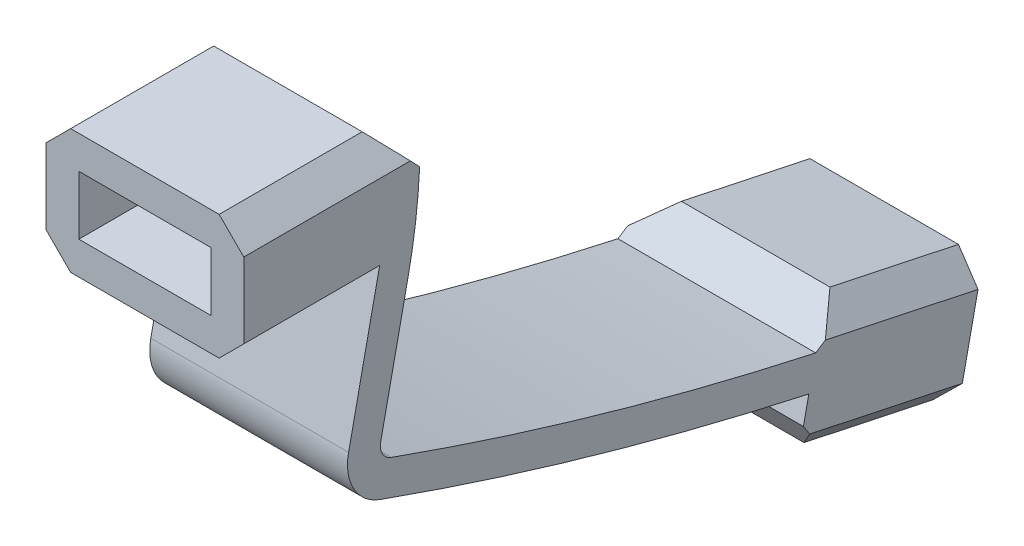
ISO-10303-21;
HEADER;
FILE_DESCRIPTION(('STEP AP214'),'2;1');
FILE_NAME('part.step','',(''),(''),'','','');
FILE_SCHEMA(('AUTOMOTIVE_DESIGN { 1 0 10303 214 1 1 1 1 }'));
ENDSEC;
DATA;
#1=APPLICATION_CONTEXT('core data for automotive mechanical design processes');
#2=APPLICATION_PROTOCOL_DEFINITION('international standard','automotive_design',2000,#1);
#3=PRODUCT_CONTEXT('',#1,'mechanical');
#4=PRODUCT('Part','Part','',(#3));
#5=PRODUCT_RELATED_PRODUCT_CATEGORY('part','',(#4));
#6=PRODUCT_DEFINITION_FORMATION('','',#4);
#7=PRODUCT_DEFINITION_CONTEXT('part definition',#1,'design');
#8=PRODUCT_DEFINITION('design','',#6,#7);
#9=PRODUCT_DEFINITION_SHAPE('','',#8);
#10=(LENGTH_UNIT() NAMED_UNIT(*) SI_UNIT(.MILLI.,.METRE.));
#11=(NAMED_UNIT(*) PLANE_ANGLE_UNIT() SI_UNIT($,.RADIAN.));
#12=(NAMED_UNIT(*) SI_UNIT($,.STERADIAN.) SOLID_ANGLE_UNIT());
#13=UNCERTAINTY_MEASURE_WITH_UNIT(LENGTH_MEASURE(1.E-05),#10,'distance_accuracy_value','');
#14=(GEOMETRIC_REPRESENTATION_CONTEXT(3) GLOBAL_UNCERTAINTY_ASSIGNED_CONTEXT((#13)) GLOBAL_UNIT_ASSIGNED_CONTEXT((#10,
#11,#12)) REPRESENTATION_CONTEXT('',''));
#15=CARTESIAN_POINT('',(0.,0.,0.));
#16=DIRECTION('',(0.,0.,1.));
#17=DIRECTION('',(1.,0.,0.));
#18=AXIS2_PLACEMENT_3D('',#15,#16,#17);
#19=CARTESIAN_POINT('',(0.,-8.40410320127912,-39.5381969639027));
#20=DIRECTION('',(0.,-0.207911690817756,-0.978147600733806));
#21=DIRECTION('',(0.,0.978147600733806,-0.207911690817756));
#22=AXIS2_PLACEMENT_3D('',#19,#20,#21);
#23=PLANE('',#22);
#24=DIRECTION('',(-1.,0.,0.));
#25=VECTOR('',#24,1.);
#26=CARTESIAN_POINT('',(-6.02,-27.7126440535357,-35.434039909482));
#27=LINE('',#26,#25);
#28=CARTESIAN_POINT('',(4.52000000000001,-27.7126440535357,-35.434039909482));
#29=VERTEX_POINT('',#28);
#30=CARTESIAN_POINT('',(-4.52,-27.7126440535357,-35.434039909482));
#31=VERTEX_POINT('',#30);
#32=EDGE_CURVE('E392',#29,#31,#27,.T.);
#33=ORIENTED_EDGE('',*,*,#32,.T.);
#34=DIRECTION('',(0.707106781186548,-0.691654801480226,0.147015766465196));
#35=VECTOR('',#34,1.);
#36=CARTESIAN_POINT('',(-12.1299525704358,-20.2689872050658,-37.0162380154442));
#37=LINE('',#36,#35);
#38=CARTESIAN_POINT('',(-6.02,-26.245422652435,-35.7459074457086));
#39=VERTEX_POINT('',#38);
#40=EDGE_CURVE('E425',#31,#39,#37,.F.);
#41=ORIENTED_EDGE('',*,*,#40,.T.);
#42=DIRECTION('',(0.,0.978147600733806,-0.207911690817756));
#43=VECTOR('',#42,1.);
#44=CARTESIAN_POINT('',(-6.02,-27.7126440535357,-35.434039909482));
#45=LINE('',#44,#43);
#46=CARTESIAN_POINT('',(-6.02,-21.7655066410741,-36.698142989654));
#47=VERTEX_POINT('',#46);
#48=EDGE_CURVE('E395',#39,#47,#45,.T.);
#49=ORIENTED_EDGE('',*,*,#48,.T.);
#50=DIRECTION('',(-0.707106781186546,-0.691654801480228,0.147015766465196));
#51=VECTOR('',#50,1.);
#52=CARTESIAN_POINT('',(3.81995257043578,-12.1405806429678,-38.7439841661398));
#53=LINE('',#52,#51);
#54=CARTESIAN_POINT('',(-4.52000000000001,-20.2982852399733,-37.0100105258806));
#55=VERTEX_POINT('',#54);
#56=EDGE_CURVE('E419',#47,#55,#53,.F.);
#57=ORIENTED_EDGE('',*,*,#56,.T.);
#58=DIRECTION('',(1.,0.,0.));
#59=VECTOR('',#58,1.);
#60=CARTESIAN_POINT('',(-6.02,-20.2982852399733,-37.0100105258806));
#61=LINE('',#60,#59);
#62=CARTESIAN_POINT('',(4.52,-20.2982852399733,-37.0100105258806));
#63=VERTEX_POINT('',#62);
#64=EDGE_CURVE('E398',#55,#63,#61,.T.);
#65=ORIENTED_EDGE('',*,*,#64,.T.);
#66=DIRECTION('',(-0.707106781186548,0.691654801480226,-0.147015766465196));
#67=VECTOR('',#66,1.);
#68=CARTESIAN_POINT('',(-3.8199525704358,-12.1405806429678,-38.7439841661398));
#69=LINE('',#68,#67);
#70=CARTESIAN_POINT('',(6.02,-21.7655066410741,-36.698142989654));
#71=VERTEX_POINT('',#70);
#72=EDGE_CURVE('E421',#63,#71,#69,.F.);
#73=ORIENTED_EDGE('',*,*,#72,.T.);
#74=DIRECTION('',(0.,-0.978147600733806,0.207911690817756));
#75=VECTOR('',#74,1.);
#76=CARTESIAN_POINT('',(6.02,-27.7126440535357,-35.434039909482));
#77=LINE('',#76,#75);
#78=CARTESIAN_POINT('',(6.02,-26.245422652435,-35.7459074457086));
#79=VERTEX_POINT('',#78);
#80=EDGE_CURVE('E389',#71,#79,#77,.T.);
#81=ORIENTED_EDGE('',*,*,#80,.T.);
#82=DIRECTION('',(0.707106781186546,0.691654801480228,-0.147015766465197));
#83=VECTOR('',#82,1.);
#84=CARTESIAN_POINT('',(12.1299525704359,-20.2689872050658,-37.0162380154442));
#85=LINE('',#84,#83);
#86=EDGE_CURVE('E423',#79,#29,#85,.F.);
#87=ORIENTED_EDGE('',*,*,#86,.T.);
#88=EDGE_LOOP('',(#33,#41,#49,#57,#65,#73,#81,#87));
#89=FACE_BOUND('',#88,.T.);
#90=DIRECTION('',(1.,0.,0.));
#91=VECTOR('',#90,1.);
#92=CARTESIAN_POINT('',(4.02,-22.2545804414409,-36.5941871442451));
#93=LINE('',#92,#91);
#94=CARTESIAN_POINT('',(-4.02,-22.2545804414409,-36.5941871442451));
#95=VERTEX_POINT('',#94);
#96=CARTESIAN_POINT('',(4.02,-22.2545804414409,-36.5941871442451));
#97=VERTEX_POINT('',#96);
#98=EDGE_CURVE('E363',#95,#97,#93,.T.);
#99=ORIENTED_EDGE('',*,*,#98,.F.);
#100=DIRECTION('',(0.,0.978147600733807,-0.207911690817754));
#101=VECTOR('',#100,1.);
#102=CARTESIAN_POINT('',(-4.02,-22.2545804414409,-36.5941871442451));
#103=LINE('',#102,#101);
#104=CARTESIAN_POINT('',(-4.02,-25.756348852068,-35.8498632911175));
#105=VERTEX_POINT('',#104);
#106=EDGE_CURVE('E361',#105,#95,#103,.T.);
#107=ORIENTED_EDGE('',*,*,#106,.F.);
#108=DIRECTION('',(-1.,0.,0.));
#109=VECTOR('',#108,1.);
#110=CARTESIAN_POINT('',(4.02,-25.756348852068,-35.8498632911175));
#111=LINE('',#110,#109);
#112=CARTESIAN_POINT('',(4.02,-25.756348852068,-35.8498632911175));
#113=VERTEX_POINT('',#112);
#114=EDGE_CURVE('E369',#113,#105,#111,.T.);
#115=ORIENTED_EDGE('',*,*,#114,.F.);
#116=DIRECTION('',(0.,-0.978147600733807,0.207911690817754));
#117=VECTOR('',#116,1.);
#118=CARTESIAN_POINT('',(4.02,-22.2545804414409,-36.5941871442451));
#119=LINE('',#118,#117);
#120=EDGE_CURVE('E366',#97,#113,#119,.T.);
#121=ORIENTED_EDGE('',*,*,#120,.F.);
#122=EDGE_LOOP('',(#99,#107,#115,#121));
#123=FACE_BOUND('',#122,.T.);
#124=ADVANCED_FACE('F47',(#89,#123),#23,.T.);
#125=CARTESIAN_POINT('',(6.02,-27.7126440535357,-35.434039909482));
#126=DIRECTION('',(-1.,0.,0.));
#127=DIRECTION('',(0.,0.,1.));
#128=AXIS2_PLACEMENT_3D('',#125,#126,#127);
#129=PLANE('',#128);
#130=CARTESIAN_POINT('',(6.02,3.29,31.3087811751068));
#131=DIRECTION('',(-1.,0.,0.));
#132=DIRECTION('',(0.,0.,-1.));
#133=AXIS2_PLACEMENT_3D('',#130,#131,#132);
#134=CIRCLE('',#133,34.0529191607878);
#135=CARTESIAN_POINT('',(6.02,1.69640478063941,-2.70682932430921));
#136=VERTEX_POINT('',#135);
#137=CARTESIAN_POINT('',(6.02,-3.79,-2.));
#138=VERTEX_POINT('',#137);
#139=EDGE_CURVE('E293',#136,#138,#134,.T.);
#140=ORIENTED_EDGE('',*,*,#139,.F.);
#141=DIRECTION('',(0.,-0.723463063908685,-0.690363089366645));
#142=VECTOR('',#141,1.);
#143=CARTESIAN_POINT('',(6.02,1.69640478063941,-2.70682932430921));
#144=LINE('',#143,#142);
#145=CARTESIAN_POINT('',(6.02,2.29,-2.14039234927273));
#146=VERTEX_POINT('',#145);
#147=EDGE_CURVE('E469',#136,#146,#144,.F.);
#148=ORIENTED_EDGE('',*,*,#147,.T.);
#149=DIRECTION('',(0.,0.,1.));
#150=VECTOR('',#149,1.);
#151=CARTESIAN_POINT('',(6.02,2.29,-35.434039909482));
#152=LINE('',#151,#150);
#153=CARTESIAN_POINT('',(6.02,2.29,8.));
#154=VERTEX_POINT('',#153);
#155=EDGE_CURVE('E430',#146,#154,#152,.T.);
#156=ORIENTED_EDGE('',*,*,#155,.T.);
#157=DIRECTION('',(0.,1.,0.));
#158=VECTOR('',#157,1.);
#159=CARTESIAN_POINT('',(6.02,3.79,8.));
#160=LINE('',#159,#158);
#161=CARTESIAN_POINT('',(6.02,-2.29,8.));
#162=VERTEX_POINT('',#161);
#163=EDGE_CURVE('E341',#162,#154,#160,.T.);
#164=ORIENTED_EDGE('',*,*,#163,.F.);
#165=DIRECTION('',(0.,0.,-1.));
#166=VECTOR('',#165,1.);
#167=CARTESIAN_POINT('',(6.02,-2.29,-35.434039909482));
#168=LINE('',#167,#166);
#169=CARTESIAN_POINT('',(6.02,-2.29,-0.274153652774979));
#170=VERTEX_POINT('',#169);
#171=EDGE_CURVE('E427',#162,#170,#168,.T.);
#172=ORIENTED_EDGE('',*,*,#171,.T.);
#173=DIRECTION('',(0.,-0.978147600733805,0.207911690817763));
#174=VECTOR('',#173,1.);
#175=CARTESIAN_POINT('',(6.02,-3.37417661836448,-0.0437047985323903));
#176=LINE('',#175,#174);
#177=CARTESIAN_POINT('',(6.02,-11.1993574242349,1.61958872800971));
#178=VERTEX_POINT('',#177);
#179=EDGE_CURVE('E295',#170,#178,#176,.T.);
#180=ORIENTED_EDGE('',*,*,#179,.T.);
#181=CARTESIAN_POINT('',(6.02,-11.8230924966882,-1.3148540741917));
#182=DIRECTION('',(1.,0.,0.));
#183=DIRECTION('',(0.,-1.,0.));
#184=AXIS2_PLACEMENT_3D('',#181,#182,#183);
#185=CIRCLE('',#184,3.);
#186=CARTESIAN_POINT('',(6.02,-14.6476856240552,-0.304075332413306));
#187=VERTEX_POINT('',#186);
#188=EDGE_CURVE('E297',#178,#187,#185,.T.);
#189=ORIENTED_EDGE('',*,*,#188,.T.);
#190=CARTESIAN_POINT('',(6.02,183.811640679964,-71.3226111321949));
#191=DIRECTION('',(1.,0.,0.));
#192=DIRECTION('',(0.,-1.,0.));
#193=AXIS2_PLACEMENT_3D('',#190,#191,#192);
#194=CIRCLE('',#193,210.783625132955);
#195=CARTESIAN_POINT('',(6.02,-22.1288171767831,-26.3975130027149));
#196=VERTEX_POINT('',#195);
#197=EDGE_CURVE('E270',#187,#196,#194,.T.);
#198=ORIENTED_EDGE('',*,*,#197,.T.);
#199=DIRECTION('',(0.,0.978147600733806,-0.207911690817756));
#200=VECTOR('',#199,1.);
#201=CARTESIAN_POINT('',(6.02,-25.6335271453581,-25.6525639021439));
#202=LINE('',#201,#200);
#203=CARTESIAN_POINT('',(6.02,-23.6772319438905,-26.0683872837794));
#204=VERTEX_POINT('',#203);
#205=EDGE_CURVE('E358',#204,#196,#202,.T.);
#206=ORIENTED_EDGE('',*,*,#205,.F.);
#207=DIRECTION('',(0.,0.838670567945421,0.544639035015032));
#208=VECTOR('',#207,1.);
#209=CARTESIAN_POINT('',(6.02,-23.6772319438905,-26.0683872837794));
#210=LINE('',#209,#208);
#211=CARTESIAN_POINT('',(6.02,-24.2702615896663,-26.4535052387375));
#212=VERTEX_POINT('',#211);
#213=EDGE_CURVE('E467',#204,#212,#210,.F.);
#214=ORIENTED_EDGE('',*,*,#213,.T.);
#215=DIRECTION('',(0.,-0.207911690817755,-0.978147600733807));
#216=VECTOR('',#215,1.);
#217=CARTESIAN_POINT('',(6.02,-26.245422652435,-35.7459074457086));
#218=LINE('',#217,#216);
#219=EDGE_CURVE('E434',#212,#79,#218,.T.);
#220=ORIENTED_EDGE('',*,*,#219,.T.);
#221=ORIENTED_EDGE('',*,*,#80,.F.);
#222=DIRECTION('',(0.,0.207911690817755,0.978147600733807));
#223=VECTOR('',#222,1.);
#224=CARTESIAN_POINT('',(6.02,-21.7655066410741,-36.6981429896539));
#225=LINE('',#224,#223);
#226=CARTESIAN_POINT('',(6.02,-19.7903455783054,-27.4057407826828));
#227=VERTEX_POINT('',#226);
#228=EDGE_CURVE('E432',#71,#227,#225,.T.);
#229=ORIENTED_EDGE('',*,*,#228,.T.);
#230=DIRECTION('',(0.,0.544639035015026,-0.838670567945425));
#231=VECTOR('',#230,1.);
#232=CARTESIAN_POINT('',(6.02,-18.6349917134313,-29.1848297200102));
#233=LINE('',#232,#231);
#234=CARTESIAN_POINT('',(6.02,-20.1731375609003,-26.8162928202559));
#235=VERTEX_POINT('',#234);
#236=EDGE_CURVE('E285',#227,#235,#233,.F.);
#237=ORIENTED_EDGE('',*,*,#236,.T.);
#238=CARTESIAN_POINT('',(6.02,183.811640679964,-71.3226111321949));
#239=DIRECTION('',(1.,0.,0.));
#240=DIRECTION('',(0.,0.,-1.));
#241=AXIS2_PLACEMENT_3D('',#238,#239,#240);
#242=CIRCLE('',#241,208.783625132955);
#243=CARTESIAN_POINT('',(6.02,-12.7646235391438,-0.977927826932137));
#244=VERTEX_POINT('',#243);
#245=EDGE_CURVE('E263',#244,#235,#242,.T.);
#246=ORIENTED_EDGE('',*,*,#245,.F.);
#247=CARTESIAN_POINT('',(6.02,-11.8230924966882,-1.3148540741917));
#248=DIRECTION('',(1.,0.,0.));
#249=DIRECTION('',(0.,0.,-1.));
#250=AXIS2_PLACEMENT_3D('',#247,#248,#249);
#251=CIRCLE('',#250,1.);
#252=CARTESIAN_POINT('',(6.02,-11.6151808058704,-0.336706473457898));
#253=VERTEX_POINT('',#252);
#254=EDGE_CURVE('E273',#253,#244,#251,.T.);
#255=ORIENTED_EDGE('',*,*,#254,.F.);
#256=DIRECTION('',(0.,-0.978147600733805,0.207911690817763));
#257=VECTOR('',#256,1.);
#258=CARTESIAN_POINT('',(6.02,-3.79,-2.));
#259=LINE('',#258,#257);
#260=EDGE_CURVE('E279',#138,#253,#259,.T.);
#261=ORIENTED_EDGE('',*,*,#260,.F.);
#262=EDGE_LOOP('',(#140,#148,#156,#164,#172,#180,#189,#198,#206,#214,#220,#221,#229,#237,#246,
#255,#261));
#263=FACE_BOUND('',#262,.T.);
#264=ADVANCED_FACE('F282',(#263),#129,.F.);
#265=CARTESIAN_POINT('',(-6.02,-27.7126440535357,-35.434039909482));
#266=DIRECTION('',(0.,0.978147600733807,-0.207911690817755));
#267=DIRECTION('',(0.,0.207911690817755,0.978147600733807));
#268=AXIS2_PLACEMENT_3D('',#265,#266,#267);
#269=PLANE('',#268);
#270=DIRECTION('',(0.,0.207911690817755,0.978147600733807));
#271=VECTOR('',#270,1.);
#272=CARTESIAN_POINT('',(4.52000000000001,-27.7126440535357,-35.434039909482));
#273=LINE('',#272,#271);
#274=CARTESIAN_POINT('',(4.52000000000001,-26.0493505269936,-27.6088591036115));
#275=VERTEX_POINT('',#274);
#276=EDGE_CURVE('E414',#29,#275,#273,.T.);
#277=ORIENTED_EDGE('',*,*,#276,.T.);
#278=DIRECTION('',(-1.,0.,0.));
#279=VECTOR('',#278,1.);
#280=CARTESIAN_POINT('',(-6.02,-26.0493505269936,-27.6088591036115));
#281=LINE('',#280,#279);
#282=CARTESIAN_POINT('',(-4.52,-26.0493505269936,-27.6088591036115));
#283=VERTEX_POINT('',#282);
#284=EDGE_CURVE('E488',#275,#283,#281,.T.);
#285=ORIENTED_EDGE('',*,*,#284,.T.);
#286=DIRECTION('',(0.,-0.207911690817755,-0.978147600733807));
#287=VECTOR('',#286,1.);
#288=CARTESIAN_POINT('',(-4.52,-27.7126440535357,-35.434039909482));
#289=LINE('',#288,#287);
#290=EDGE_CURVE('E417',#283,#31,#289,.T.);
#291=ORIENTED_EDGE('',*,*,#290,.T.);
#292=ORIENTED_EDGE('',*,*,#32,.F.);
#293=EDGE_LOOP('',(#277,#285,#291,#292));
#294=FACE_BOUND('',#293,.T.);
#295=ADVANCED_FACE('F526',(#294),#269,.F.);
#296=CARTESIAN_POINT('',(-6.02,-27.7126440535357,-35.434039909482));
#297=DIRECTION('',(1.,0.,0.));
#298=DIRECTION('',(0.,0.,-1.));
#299=AXIS2_PLACEMENT_3D('',#296,#297,#298);
#300=PLANE('',#299);
#301=DIRECTION('',(0.,0.,-1.));
#302=VECTOR('',#301,1.);
#303=CARTESIAN_POINT('',(-6.02,2.29,-35.434039909482));
#304=LINE('',#303,#302);
#305=CARTESIAN_POINT('',(-6.02,2.29,8.));
#306=VERTEX_POINT('',#305);
#307=CARTESIAN_POINT('',(-6.02,2.29,-2.14039234927274));
#308=VERTEX_POINT('',#307);
#309=EDGE_CURVE('E404',#306,#308,#304,.T.);
#310=ORIENTED_EDGE('',*,*,#309,.T.);
#311=DIRECTION('',(0.,0.723463063908685,0.690363089366645));
#312=VECTOR('',#311,1.);
#313=CARTESIAN_POINT('',(-6.02,1.69640478063941,-2.70682932430921));
#314=LINE('',#313,#312);
#315=CARTESIAN_POINT('',(-6.02,1.69640478063941,-2.70682932430921));
#316=VERTEX_POINT('',#315);
#317=EDGE_CURVE('E481',#308,#316,#314,.F.);
#318=ORIENTED_EDGE('',*,*,#317,.T.);
#319=CARTESIAN_POINT('',(-6.02,3.29,31.3087811751068));
#320=DIRECTION('',(1.,0.,0.));
#321=DIRECTION('',(0.,0.,-1.));
#322=AXIS2_PLACEMENT_3D('',#319,#320,#321);
#323=CIRCLE('',#322,34.0529191607878);
#324=CARTESIAN_POINT('',(-6.02,-3.79,-2.));
#325=VERTEX_POINT('',#324);
#326=EDGE_CURVE('E623',#325,#316,#323,.T.);
#327=ORIENTED_EDGE('',*,*,#326,.F.);
#328=DIRECTION('',(0.,0.978147600733805,-0.207911690817763));
#329=VECTOR('',#328,1.);
#330=CARTESIAN_POINT('',(-6.02,-3.79,-2.));
#331=LINE('',#330,#329);
#332=CARTESIAN_POINT('',(-6.02,-11.6151808058704,-0.336706473457898));
#333=VERTEX_POINT('',#332);
#334=EDGE_CURVE('E628',#333,#325,#331,.T.);
#335=ORIENTED_EDGE('',*,*,#334,.F.);
#336=CARTESIAN_POINT('',(-6.02,-11.8230924966882,-1.3148540741917));
#337=DIRECTION('',(1.,0.,0.));
#338=DIRECTION('',(0.,0.,-1.));
#339=AXIS2_PLACEMENT_3D('',#336,#337,#338);
#340=CIRCLE('',#339,1.);
#341=CARTESIAN_POINT('',(-6.02,-12.7646235391438,-0.977927826932137));
#342=VERTEX_POINT('',#341);
#343=EDGE_CURVE('E630',#342,#333,#340,.F.);
#344=ORIENTED_EDGE('',*,*,#343,.F.);
#345=CARTESIAN_POINT('',(-6.02,183.811640679964,-71.3226111321949));
#346=DIRECTION('',(1.,0.,0.));
#347=DIRECTION('',(0.,0.,-1.));
#348=AXIS2_PLACEMENT_3D('',#345,#346,#347);
#349=CIRCLE('',#348,208.783625132955);
#350=CARTESIAN_POINT('',(-6.02,-20.1731375609003,-26.8162928202559));
#351=VERTEX_POINT('',#350);
#352=EDGE_CURVE('E265',#351,#342,#349,.F.);
#353=ORIENTED_EDGE('',*,*,#352,.F.);
#354=DIRECTION('',(0.,-0.544639035015026,0.838670567945425));
#355=VECTOR('',#354,1.);
#356=CARTESIAN_POINT('',(-6.02,-18.6349917134313,-29.1848297200102));
#357=LINE('',#356,#355);
#358=CARTESIAN_POINT('',(-6.02,-19.7903455783054,-27.4057407826828));
#359=VERTEX_POINT('',#358);
#360=EDGE_CURVE('E477',#351,#359,#357,.F.);
#361=ORIENTED_EDGE('',*,*,#360,.T.);
#362=DIRECTION('',(0.,-0.207911690817755,-0.978147600733807));
#363=VECTOR('',#362,1.);
#364=CARTESIAN_POINT('',(-6.02,-21.7655066410741,-36.6981429896539));
#365=LINE('',#364,#363);
#366=EDGE_CURVE('E409',#359,#47,#365,.T.);
#367=ORIENTED_EDGE('',*,*,#366,.T.);
#368=ORIENTED_EDGE('',*,*,#48,.F.);
#369=DIRECTION('',(0.,0.207911690817755,0.978147600733807));
#370=VECTOR('',#369,1.);
#371=CARTESIAN_POINT('',(-6.02,-26.245422652435,-35.7459074457086));
#372=LINE('',#371,#370);
#373=CARTESIAN_POINT('',(-6.02,-24.2702615896663,-26.4535052387375));
#374=VERTEX_POINT('',#373);
#375=EDGE_CURVE('E411',#39,#374,#372,.T.);
#376=ORIENTED_EDGE('',*,*,#375,.T.);
#377=DIRECTION('',(0.,-0.838670567945421,-0.544639035015032));
#378=VECTOR('',#377,1.);
#379=CARTESIAN_POINT('',(-6.02,-23.6772319438905,-26.0683872837794));
#380=LINE('',#379,#378);
#381=CARTESIAN_POINT('',(-6.02,-23.6772319438905,-26.0683872837794));
#382=VERTEX_POINT('',#381);
#383=EDGE_CURVE('E479',#374,#382,#380,.F.);
#384=ORIENTED_EDGE('',*,*,#383,.T.);
#385=DIRECTION('',(0.,0.978147600733806,-0.207911690817756));
#386=VECTOR('',#385,1.);
#387=CARTESIAN_POINT('',(-6.02,-25.6335271453581,-25.6525639021439));
#388=LINE('',#387,#386);
#389=CARTESIAN_POINT('',(-6.02,-22.1288171767831,-26.3975130027149));
#390=VERTEX_POINT('',#389);
#391=EDGE_CURVE('E356',#382,#390,#388,.T.);
#392=ORIENTED_EDGE('',*,*,#391,.T.);
#393=CARTESIAN_POINT('',(-6.02,183.811640679964,-71.3226111321949));
#394=DIRECTION('',(1.,0.,0.));
#395=DIRECTION('',(0.,0.,-1.));
#396=AXIS2_PLACEMENT_3D('',#393,#394,#395);
#397=CIRCLE('',#396,210.783625132955);
#398=CARTESIAN_POINT('',(-6.02,-14.6476856240552,-0.304075332413307));
#399=VERTEX_POINT('',#398);
#400=EDGE_CURVE('E289',#390,#399,#397,.F.);
#401=ORIENTED_EDGE('',*,*,#400,.T.);
#402=CARTESIAN_POINT('',(-6.02,-11.8230924966882,-1.3148540741917));
#403=DIRECTION('',(1.,0.,0.));
#404=DIRECTION('',(0.,0.,-1.));
#405=AXIS2_PLACEMENT_3D('',#402,#403,#404);
#406=CIRCLE('',#405,3.);
#407=CARTESIAN_POINT('',(-6.02,-11.1993574242349,1.61958872800971));
#408=VERTEX_POINT('',#407);
#409=EDGE_CURVE('E621',#399,#408,#406,.F.);
#410=ORIENTED_EDGE('',*,*,#409,.T.);
#411=DIRECTION('',(0.,0.978147600733805,-0.207911690817763));
#412=VECTOR('',#411,1.);
#413=CARTESIAN_POINT('',(-6.02,-3.37417661836448,-0.0437047985323903));
#414=LINE('',#413,#412);
#415=CARTESIAN_POINT('',(-6.02,-2.29,-0.274153652774979));
#416=VERTEX_POINT('',#415);
#417=EDGE_CURVE('E622',#408,#416,#414,.T.);
#418=ORIENTED_EDGE('',*,*,#417,.T.);
#419=DIRECTION('',(0.,0.,1.));
#420=VECTOR('',#419,1.);
#421=CARTESIAN_POINT('',(-6.02,-2.29,-35.434039909482));
#422=LINE('',#421,#420);
#423=CARTESIAN_POINT('',(-6.02,-2.29,8.));
#424=VERTEX_POINT('',#423);
#425=EDGE_CURVE('E407',#416,#424,#422,.T.);
#426=ORIENTED_EDGE('',*,*,#425,.T.);
#427=DIRECTION('',(0.,-1.,0.));
#428=VECTOR('',#427,1.);
#429=CARTESIAN_POINT('',(-6.02,3.79,8.));
#430=LINE('',#429,#428);
#431=EDGE_CURVE('E347',#306,#424,#430,.T.);
#432=ORIENTED_EDGE('',*,*,#431,.F.);
#433=EDGE_LOOP('',(#310,#318,#327,#335,#344,#353,#361,#367,#368,#376,#384,#392,#401,#410,#418,
#426,#432));
#434=FACE_BOUND('',#433,.T.);
#435=ADVANCED_FACE('F506',(#434),#300,.F.);
#436=CARTESIAN_POINT('',(-6.02,-20.2982852399733,-37.0100105258806));
#437=DIRECTION('',(0.,-0.978147600733807,0.207911690817755));
#438=DIRECTION('',(0.,-0.207911690817755,-0.978147600733807));
#439=AXIS2_PLACEMENT_3D('',#436,#437,#438);
#440=PLANE('',#439);
#441=DIRECTION('',(0.,0.207911690817755,0.978147600733807));
#442=VECTOR('',#441,1.);
#443=CARTESIAN_POINT('',(-4.52000000000001,-20.2982852399733,-37.0100105258806));
#444=LINE('',#443,#442);
#445=CARTESIAN_POINT('',(-4.52000000000001,-18.6349917134313,-29.1848297200102));
#446=VERTEX_POINT('',#445);
#447=EDGE_CURVE('E436',#55,#446,#444,.T.);
#448=ORIENTED_EDGE('',*,*,#447,.T.);
#449=DIRECTION('',(1.,0.,0.));
#450=VECTOR('',#449,1.);
#451=CARTESIAN_POINT('',(-6.02,-18.6349917134313,-29.1848297200102));
#452=LINE('',#451,#450);
#453=CARTESIAN_POINT('',(4.52,-18.6349917134313,-29.1848297200102));
#454=VERTEX_POINT('',#453);
#455=EDGE_CURVE('E492',#446,#454,#452,.T.);
#456=ORIENTED_EDGE('',*,*,#455,.T.);
#457=DIRECTION('',(0.,-0.207911690817755,-0.978147600733807));
#458=VECTOR('',#457,1.);
#459=CARTESIAN_POINT('',(4.52,-20.2982852399733,-37.0100105258806));
#460=LINE('',#459,#458);
#461=EDGE_CURVE('E438',#454,#63,#460,.T.);
#462=ORIENTED_EDGE('',*,*,#461,.T.);
#463=ORIENTED_EDGE('',*,*,#64,.F.);
#464=EDGE_LOOP('',(#448,#456,#462,#463));
#465=FACE_BOUND('',#464,.T.);
#466=ADVANCED_FACE('F514',(#465),#440,.F.);
#467=CARTESIAN_POINT('',(-4.02,-22.2545804414409,-36.5941871442451));
#468=DIRECTION('',(1.,0.,0.));
#469=DIRECTION('',(0.,0.,-1.));
#470=AXIS2_PLACEMENT_3D('',#467,#468,#469);
#471=PLANE('',#470);
#472=DIRECTION('',(0.,0.978147600733807,-0.207911690817754));
#473=VECTOR('',#472,1.);
#474=CARTESIAN_POINT('',(-4.02,-20.5912869148989,-28.7690063383746));
#475=LINE('',#474,#473);
#476=CARTESIAN_POINT('',(-4.02,-24.093055325526,-28.0246824852471));
#477=VERTEX_POINT('',#476);
#478=CARTESIAN_POINT('',(-4.02,-20.5912869148989,-28.7690063383746));
#479=VERTEX_POINT('',#478);
#480=EDGE_CURVE('E360',#477,#479,#475,.T.);
#481=ORIENTED_EDGE('',*,*,#480,.F.);
#482=DIRECTION('',(0.,0.207911690817755,0.978147600733807));
#483=VECTOR('',#482,1.);
#484=CARTESIAN_POINT('',(-4.02,-25.756348852068,-35.8498632911175));
#485=LINE('',#484,#483);
#486=EDGE_CURVE('E371',#105,#477,#485,.T.);
#487=ORIENTED_EDGE('',*,*,#486,.F.);
#488=ORIENTED_EDGE('',*,*,#106,.T.);
#489=DIRECTION('',(0.,0.207911690817755,0.978147600733807));
#490=VECTOR('',#489,1.);
#491=CARTESIAN_POINT('',(-4.02,-22.2545804414409,-36.5941871442451));
#492=LINE('',#491,#490);
#493=EDGE_CURVE('E386',#95,#479,#492,.T.);
#494=ORIENTED_EDGE('',*,*,#493,.T.);
#495=EDGE_LOOP('',(#481,#487,#488,#494));
#496=FACE_BOUND('',#495,.T.);
#497=ADVANCED_FACE('F516',(#496),#471,.T.);
#498=CARTESIAN_POINT('',(4.02,-22.2545804414409,-36.5941871442451));
#499=DIRECTION('',(0.,-0.978147600733807,0.207911690817755));
#500=DIRECTION('',(0.,-0.207911690817755,-0.978147600733807));
#501=AXIS2_PLACEMENT_3D('',#498,#499,#500);
#502=PLANE('',#501);
#503=DIRECTION('',(1.,0.,0.));
#504=VECTOR('',#503,1.);
#505=CARTESIAN_POINT('',(4.02,-20.5912869148989,-28.7690063383746));
#506=LINE('',#505,#504);
#507=CARTESIAN_POINT('',(4.02,-20.5912869148989,-28.7690063383746));
#508=VERTEX_POINT('',#507);
#509=EDGE_CURVE('E373',#479,#508,#506,.T.);
#510=ORIENTED_EDGE('',*,*,#509,.F.);
#511=ORIENTED_EDGE('',*,*,#493,.F.);
#512=ORIENTED_EDGE('',*,*,#98,.T.);
#513=DIRECTION('',(0.,0.207911690817755,0.978147600733807));
#514=VECTOR('',#513,1.);
#515=CARTESIAN_POINT('',(4.02,-22.2545804414409,-36.5941871442451));
#516=LINE('',#515,#514);
#517=EDGE_CURVE('E384',#97,#508,#516,.T.);
#518=ORIENTED_EDGE('',*,*,#517,.T.);
#519=EDGE_LOOP('',(#510,#511,#512,#518));
#520=FACE_BOUND('',#519,.T.);
#521=ADVANCED_FACE('F523',(#520),#502,.T.);
#522=CARTESIAN_POINT('',(4.02,-22.2545804414409,-36.5941871442451));
#523=DIRECTION('',(-1.,0.,0.));
#524=DIRECTION('',(0.,0.,1.));
#525=AXIS2_PLACEMENT_3D('',#522,#523,#524);
#526=PLANE('',#525);
#527=DIRECTION('',(0.,-0.978147600733807,0.207911690817754));
#528=VECTOR('',#527,1.);
#529=CARTESIAN_POINT('',(4.02,-20.5912869148989,-28.7690063383746));
#530=LINE('',#529,#528);
#531=CARTESIAN_POINT('',(4.02,-24.093055325526,-28.024682485247));
#532=VERTEX_POINT('',#531);
#533=EDGE_CURVE('E376',#508,#532,#530,.T.);
#534=ORIENTED_EDGE('',*,*,#533,.F.);
#535=ORIENTED_EDGE('',*,*,#517,.F.);
#536=ORIENTED_EDGE('',*,*,#120,.T.);
#537=DIRECTION('',(0.,0.207911690817755,0.978147600733807));
#538=VECTOR('',#537,1.);
#539=CARTESIAN_POINT('',(4.02,-25.756348852068,-35.8498632911175));
#540=LINE('',#539,#538);
#541=EDGE_CURVE('E381',#113,#532,#540,.T.);
#542=ORIENTED_EDGE('',*,*,#541,.T.);
#543=EDGE_LOOP('',(#534,#535,#536,#542));
#544=FACE_BOUND('',#543,.T.);
#545=ADVANCED_FACE('F539',(#544),#526,.T.);
#546=CARTESIAN_POINT('',(4.02,-25.756348852068,-35.8498632911175));
#547=DIRECTION('',(0.,0.978147600733807,-0.207911690817755));
#548=DIRECTION('',(0.,0.207911690817755,0.978147600733807));
#549=AXIS2_PLACEMENT_3D('',#546,#547,#548);
#550=PLANE('',#549);
#551=DIRECTION('',(-1.,0.,0.));
#552=VECTOR('',#551,1.);
#553=CARTESIAN_POINT('',(4.02,-24.093055325526,-28.024682485247));
#554=LINE('',#553,#552);
#555=EDGE_CURVE('E364',#532,#477,#554,.T.);
#556=ORIENTED_EDGE('',*,*,#555,.F.);
#557=ORIENTED_EDGE('',*,*,#541,.F.);
#558=ORIENTED_EDGE('',*,*,#114,.T.);
#559=ORIENTED_EDGE('',*,*,#486,.T.);
#560=EDGE_LOOP('',(#556,#557,#558,#559));
#561=FACE_BOUND('',#560,.T.);
#562=ADVANCED_FACE('F543',(#561),#550,.T.);
#563=CARTESIAN_POINT('',(0.,-6.74080967473708,-31.7130161580323));
#564=DIRECTION('',(0.,-0.207911690817756,-0.978147600733806));
#565=DIRECTION('',(0.,0.978147600733806,-0.207911690817756));
#566=AXIS2_PLACEMENT_3D('',#563,#564,#565);
#567=PLANE('',#566);
#568=ORIENTED_EDGE('',*,*,#533,.T.);
#569=ORIENTED_EDGE('',*,*,#555,.T.);
#570=ORIENTED_EDGE('',*,*,#480,.T.);
#571=ORIENTED_EDGE('',*,*,#509,.T.);
#572=EDGE_LOOP('',(#568,#569,#570,#571));
#573=FACE_BOUND('',#572,.T.);
#574=ADVANCED_FACE('F547',(#573),#567,.T.);
#575=CARTESIAN_POINT('',(0.,-6.32498629310157,-29.7567209565647));
#576=DIRECTION('',(0.,-0.207911690817756,-0.978147600733806));
#577=DIRECTION('',(0.,0.978147600733806,-0.207911690817756));
#578=AXIS2_PLACEMENT_3D('',#575,#576,#577);
#579=PLANE('',#578);
#580=ORIENTED_EDGE('',*,*,#391,.F.);
#581=DIRECTION('',(1.,0.,0.));
#582=VECTOR('',#581,1.);
#583=CARTESIAN_POINT('',(0.,-23.6772319438905,-26.0683872837794));
#584=LINE('',#583,#582);
#585=EDGE_CURVE('E483',#382,#204,#584,.T.);
#586=ORIENTED_EDGE('',*,*,#585,.T.);
#587=ORIENTED_EDGE('',*,*,#205,.T.);
#588=DIRECTION('',(1.,0.,0.));
#589=VECTOR('',#588,1.);
#590=CARTESIAN_POINT('',(-46.2831794803438,-22.1288171767831,-26.3975130027149));
#591=LINE('',#590,#589);
#592=EDGE_CURVE('E401',#196,#390,#591,.F.);
#593=ORIENTED_EDGE('',*,*,#592,.T.);
#594=EDGE_LOOP('',(#580,#586,#587,#593));
#595=FACE_BOUND('',#594,.T.);
#596=ADVANCED_FACE('F551',(#595),#579,.F.);
#597=CARTESIAN_POINT('',(-46.2831794803438,183.811640679964,-71.3226111321949));
#598=DIRECTION('',(1.,0.,0.));
#599=DIRECTION('',(0.,0.,-1.));
#600=AXIS2_PLACEMENT_3D('',#597,#598,#599);
#601=CYLINDRICAL_SURFACE('',#600,208.783625132955);
#602=ORIENTED_EDGE('',*,*,#245,.T.);
#603=DIRECTION('',(1.,0.,0.));
#604=VECTOR('',#603,1.);
#605=CARTESIAN_POINT('',(0.,-20.1731375609002,-26.8162928202559));
#606=LINE('',#605,#604);
#607=EDGE_CURVE('E11',#235,#351,#606,.F.);
#608=ORIENTED_EDGE('',*,*,#607,.T.);
#609=ORIENTED_EDGE('',*,*,#352,.T.);
#610=DIRECTION('',(1.,0.,0.));
#611=VECTOR('',#610,1.);
#612=CARTESIAN_POINT('',(-46.2831794803438,-12.7646235391438,-0.977927826932137));
#613=LINE('',#612,#611);
#614=EDGE_CURVE('E259',#342,#244,#613,.T.);
#615=ORIENTED_EDGE('',*,*,#614,.T.);
#616=EDGE_LOOP('',(#602,#608,#609,#615));
#617=FACE_BOUND('',#616,.T.);
#618=ADVANCED_FACE('F261',(#617),#601,.F.);
#619=CARTESIAN_POINT('',(-46.2831794803438,183.811640679964,-71.3226111321949));
#620=DIRECTION('',(1.,0.,0.));
#621=DIRECTION('',(0.,0.,-1.));
#622=AXIS2_PLACEMENT_3D('',#619,#620,#621);
#623=CYLINDRICAL_SURFACE('',#622,210.783625132955);
#624=ORIENTED_EDGE('',*,*,#592,.F.);
#625=ORIENTED_EDGE('',*,*,#197,.F.);
#626=DIRECTION('',(1.,0.,0.));
#627=VECTOR('',#626,1.);
#628=CARTESIAN_POINT('',(-46.2831794803438,-14.6476856240552,-0.304075332413306));
#629=LINE('',#628,#627);
#630=EDGE_CURVE('E302',#399,#187,#629,.T.);
#631=ORIENTED_EDGE('',*,*,#630,.F.);
#632=ORIENTED_EDGE('',*,*,#400,.F.);
#633=EDGE_LOOP('',(#624,#625,#631,#632));
#634=FACE_BOUND('',#633,.T.);
#635=ADVANCED_FACE('F566',(#634),#623,.T.);
#636=CARTESIAN_POINT('',(0.,0.,8.));
#637=DIRECTION('',(0.,0.,1.));
#638=DIRECTION('',(1.,0.,0.));
#639=AXIS2_PLACEMENT_3D('',#636,#637,#638);
#640=PLANE('',#639);
#641=ORIENTED_EDGE('',*,*,#163,.T.);
#642=DIRECTION('',(0.707106781186548,-0.707106781186548,0.));
#643=VECTOR('',#642,1.);
#644=CARTESIAN_POINT('',(4.155,4.155,8.));
#645=LINE('',#644,#643);
#646=CARTESIAN_POINT('',(4.52000000000001,3.79,8.));
#647=VERTEX_POINT('',#646);
#648=EDGE_CURVE('E451',#154,#647,#645,.F.);
#649=ORIENTED_EDGE('',*,*,#648,.T.);
#650=DIRECTION('',(-1.,0.,0.));
#651=VECTOR('',#650,1.);
#652=CARTESIAN_POINT('',(-6.02,3.79,8.));
#653=LINE('',#652,#651);
#654=CARTESIAN_POINT('',(-4.52,3.79,8.));
#655=VERTEX_POINT('',#654);
#656=EDGE_CURVE('E344',#647,#655,#653,.T.);
#657=ORIENTED_EDGE('',*,*,#656,.T.);
#658=DIRECTION('',(0.707106781186548,0.707106781186548,0.));
#659=VECTOR('',#658,1.);
#660=CARTESIAN_POINT('',(-4.155,4.155,8.));
#661=LINE('',#660,#659);
#662=EDGE_CURVE('E445',#655,#306,#661,.F.);
#663=ORIENTED_EDGE('',*,*,#662,.T.);
#664=ORIENTED_EDGE('',*,*,#431,.T.);
#665=DIRECTION('',(-0.707106781186546,0.707106781186549,0.));
#666=VECTOR('',#665,1.);
#667=CARTESIAN_POINT('',(-4.15500000000001,-4.155,8.));
#668=LINE('',#667,#666);
#669=CARTESIAN_POINT('',(-4.52000000000001,-3.79,8.));
#670=VERTEX_POINT('',#669);
#671=EDGE_CURVE('E447',#424,#670,#668,.F.);
#672=ORIENTED_EDGE('',*,*,#671,.T.);
#673=DIRECTION('',(1.,0.,0.));
#674=VECTOR('',#673,1.);
#675=CARTESIAN_POINT('',(-6.02,-3.79,8.));
#676=LINE('',#675,#674);
#677=CARTESIAN_POINT('',(4.52,-3.79,8.));
#678=VERTEX_POINT('',#677);
#679=EDGE_CURVE('E350',#670,#678,#676,.T.);
#680=ORIENTED_EDGE('',*,*,#679,.T.);
#681=DIRECTION('',(-0.707106781186548,-0.707106781186547,0.));
#682=VECTOR('',#681,1.);
#683=CARTESIAN_POINT('',(4.155,-4.155,8.));
#684=LINE('',#683,#682);
#685=EDGE_CURVE('E449',#678,#162,#684,.F.);
#686=ORIENTED_EDGE('',*,*,#685,.T.);
#687=EDGE_LOOP('',(#641,#649,#657,#663,#664,#672,#680,#686));
#688=FACE_BOUND('',#687,.T.);
#689=DIRECTION('',(1.,0.,0.));
#690=VECTOR('',#689,1.);
#691=CARTESIAN_POINT('',(4.02,-1.79,8.));
#692=LINE('',#691,#690);
#693=CARTESIAN_POINT('',(-4.02,-1.79,8.));
#694=VERTEX_POINT('',#693);
#695=CARTESIAN_POINT('',(4.02,-1.79,8.));
#696=VERTEX_POINT('',#695);
#697=EDGE_CURVE('E313',#694,#696,#692,.T.);
#698=ORIENTED_EDGE('',*,*,#697,.F.);
#699=DIRECTION('',(0.,-1.,0.));
#700=VECTOR('',#699,1.);
#701=CARTESIAN_POINT('',(-4.02,-1.79,8.));
#702=LINE('',#701,#700);
#703=CARTESIAN_POINT('',(-4.02,1.79,8.));
#704=VERTEX_POINT('',#703);
#705=EDGE_CURVE('E311',#704,#694,#702,.T.);
#706=ORIENTED_EDGE('',*,*,#705,.F.);
#707=DIRECTION('',(-1.,0.,0.));
#708=VECTOR('',#707,1.);
#709=CARTESIAN_POINT('',(4.02,1.79,8.));
#710=LINE('',#709,#708);
#711=CARTESIAN_POINT('',(4.02,1.79,8.));
#712=VERTEX_POINT('',#711);
#713=EDGE_CURVE('E319',#712,#704,#710,.T.);
#714=ORIENTED_EDGE('',*,*,#713,.F.);
#715=DIRECTION('',(0.,1.,0.));
#716=VECTOR('',#715,1.);
#717=CARTESIAN_POINT('',(4.02,-1.79,8.));
#718=LINE('',#717,#716);
#719=EDGE_CURVE('E316',#696,#712,#718,.T.);
#720=ORIENTED_EDGE('',*,*,#719,.F.);
#721=EDGE_LOOP('',(#698,#706,#714,#720));
#722=FACE_BOUND('',#721,.T.);
#723=ADVANCED_FACE('F559',(#688,#722),#640,.T.);
#724=CARTESIAN_POINT('',(-6.02,3.79,8.));
#725=DIRECTION('',(0.,-1.,0.));
#726=DIRECTION('',(0.,0.,-1.));
#727=AXIS2_PLACEMENT_3D('',#724,#725,#726);
#728=PLANE('',#727);
#729=DIRECTION('',(0.,0.,-1.));
#730=VECTOR('',#729,1.);
#731=CARTESIAN_POINT('',(4.52000000000001,3.79,8.));
#732=LINE('',#731,#730);
#733=CARTESIAN_POINT('',(4.52000000000001,3.79,-0.709020540938549));
#734=VERTEX_POINT('',#733);
#735=EDGE_CURVE('E442',#647,#734,#732,.T.);
#736=ORIENTED_EDGE('',*,*,#735,.T.);
#737=DIRECTION('',(-1.,0.,0.));
#738=VECTOR('',#737,1.);
#739=CARTESIAN_POINT('',(-6.02,3.79,-0.709020540938549));
#740=LINE('',#739,#738);
#741=CARTESIAN_POINT('',(-4.52,3.79,-0.709020540938549));
#742=VERTEX_POINT('',#741);
#743=EDGE_CURVE('E473',#734,#742,#740,.T.);
#744=ORIENTED_EDGE('',*,*,#743,.T.);
#745=DIRECTION('',(0.,0.,1.));
#746=VECTOR('',#745,1.);
#747=CARTESIAN_POINT('',(-4.52,3.79,8.));
#748=LINE('',#747,#746);
#749=EDGE_CURVE('E440',#742,#655,#748,.T.);
#750=ORIENTED_EDGE('',*,*,#749,.T.);
#751=ORIENTED_EDGE('',*,*,#656,.F.);
#752=EDGE_LOOP('',(#736,#744,#750,#751));
#753=FACE_BOUND('',#752,.T.);
#754=ADVANCED_FACE('F555',(#753),#728,.F.);
#755=CARTESIAN_POINT('',(-6.02,-3.79,8.));
#756=DIRECTION('',(0.,1.,0.));
#757=DIRECTION('',(0.,0.,1.));
#758=AXIS2_PLACEMENT_3D('',#755,#756,#757);
#759=PLANE('',#758);
#760=DIRECTION('',(1.,0.,0.));
#761=VECTOR('',#760,1.);
#762=CARTESIAN_POINT('',(-6.02,-3.79,0.0446811897300611));
#763=LINE('',#762,#761);
#764=CARTESIAN_POINT('',(-4.52000000000001,-3.79,0.0446811897300611));
#765=VERTEX_POINT('',#764);
#766=CARTESIAN_POINT('',(4.52,-3.79,0.0446811897300611));
#767=VERTEX_POINT('',#766);
#768=EDGE_CURVE('E353',#765,#767,#763,.T.);
#769=ORIENTED_EDGE('',*,*,#768,.T.);
#770=DIRECTION('',(0.,0.,1.));
#771=VECTOR('',#770,1.);
#772=CARTESIAN_POINT('',(4.52,-3.79,8.));
#773=LINE('',#772,#771);
#774=EDGE_CURVE('E456',#767,#678,#773,.T.);
#775=ORIENTED_EDGE('',*,*,#774,.T.);
#776=ORIENTED_EDGE('',*,*,#679,.F.);
#777=DIRECTION('',(0.,0.,-1.));
#778=VECTOR('',#777,1.);
#779=CARTESIAN_POINT('',(-4.52000000000001,-3.79,8.));
#780=LINE('',#779,#778);
#781=EDGE_CURVE('E453',#670,#765,#780,.T.);
#782=ORIENTED_EDGE('',*,*,#781,.T.);
#783=EDGE_LOOP('',(#769,#775,#776,#782));
#784=FACE_BOUND('',#783,.T.);
#785=ADVANCED_FACE('F558',(#784),#759,.F.);
#786=CARTESIAN_POINT('',(-4.02,-1.79,8.));
#787=DIRECTION('',(1.,0.,0.));
#788=DIRECTION('',(0.,0.,-1.));
#789=AXIS2_PLACEMENT_3D('',#786,#787,#788);
#790=PLANE('',#789);
#791=DIRECTION('',(0.,-1.,0.));
#792=VECTOR('',#791,1.);
#793=CARTESIAN_POINT('',(-4.02,-1.79,0.));
#794=LINE('',#793,#792);
#795=CARTESIAN_POINT('',(-4.02,1.79,0.));
#796=VERTEX_POINT('',#795);
#797=CARTESIAN_POINT('',(-4.02,-1.79,0.));
#798=VERTEX_POINT('',#797);
#799=EDGE_CURVE('E322',#796,#798,#794,.T.);
#800=ORIENTED_EDGE('',*,*,#799,.F.);
#801=DIRECTION('',(0.,0.,-1.));
#802=VECTOR('',#801,1.);
#803=CARTESIAN_POINT('',(-4.02,1.79,8.));
#804=LINE('',#803,#802);
#805=EDGE_CURVE('E321',#704,#796,#804,.T.);
#806=ORIENTED_EDGE('',*,*,#805,.F.);
#807=ORIENTED_EDGE('',*,*,#705,.T.);
#808=DIRECTION('',(0.,0.,-1.));
#809=VECTOR('',#808,1.);
#810=CARTESIAN_POINT('',(-4.02,-1.79,8.));
#811=LINE('',#810,#809);
#812=EDGE_CURVE('E338',#694,#798,#811,.T.);
#813=ORIENTED_EDGE('',*,*,#812,.T.);
#814=EDGE_LOOP('',(#800,#806,#807,#813));
#815=FACE_BOUND('',#814,.T.);
#816=ADVANCED_FACE('F563',(#815),#790,.T.);
#817=CARTESIAN_POINT('',(4.02,-1.79,8.));
#818=DIRECTION('',(0.,1.,0.));
#819=DIRECTION('',(0.,0.,1.));
#820=AXIS2_PLACEMENT_3D('',#817,#818,#819);
#821=PLANE('',#820);
#822=DIRECTION('',(1.,0.,0.));
#823=VECTOR('',#822,1.);
#824=CARTESIAN_POINT('',(4.02,-1.79,0.));
#825=LINE('',#824,#823);
#826=CARTESIAN_POINT('',(4.02,-1.79,0.));
#827=VERTEX_POINT('',#826);
#828=EDGE_CURVE('E325',#798,#827,#825,.T.);
#829=ORIENTED_EDGE('',*,*,#828,.F.);
#830=ORIENTED_EDGE('',*,*,#812,.F.);
#831=ORIENTED_EDGE('',*,*,#697,.T.);
#832=DIRECTION('',(0.,0.,-1.));
#833=VECTOR('',#832,1.);
#834=CARTESIAN_POINT('',(4.02,-1.79,8.));
#835=LINE('',#834,#833);
#836=EDGE_CURVE('E336',#696,#827,#835,.T.);
#837=ORIENTED_EDGE('',*,*,#836,.T.);
#838=EDGE_LOOP('',(#829,#830,#831,#837));
#839=FACE_BOUND('',#838,.T.);
#840=ADVANCED_FACE('F570',(#839),#821,.T.);
#841=CARTESIAN_POINT('',(4.02,-1.79,8.));
#842=DIRECTION('',(-1.,0.,0.));
#843=DIRECTION('',(0.,0.,1.));
#844=AXIS2_PLACEMENT_3D('',#841,#842,#843);
#845=PLANE('',#844);
#846=DIRECTION('',(0.,1.,0.));
#847=VECTOR('',#846,1.);
#848=CARTESIAN_POINT('',(4.02,-1.79,0.));
#849=LINE('',#848,#847);
#850=CARTESIAN_POINT('',(4.02,1.79,0.));
#851=VERTEX_POINT('',#850);
#852=EDGE_CURVE('E328',#827,#851,#849,.T.);
#853=ORIENTED_EDGE('',*,*,#852,.F.);
#854=ORIENTED_EDGE('',*,*,#836,.F.);
#855=ORIENTED_EDGE('',*,*,#719,.T.);
#856=DIRECTION('',(0.,0.,-1.));
#857=VECTOR('',#856,1.);
#858=CARTESIAN_POINT('',(4.02,1.79,8.));
#859=LINE('',#858,#857);
#860=EDGE_CURVE('E334',#712,#851,#859,.T.);
#861=ORIENTED_EDGE('',*,*,#860,.T.);
#862=EDGE_LOOP('',(#853,#854,#855,#861));
#863=FACE_BOUND('',#862,.T.);
#864=ADVANCED_FACE('F574',(#863),#845,.T.);
#865=CARTESIAN_POINT('',(4.02,1.79,8.));
#866=DIRECTION('',(0.,-1.,0.));
#867=DIRECTION('',(0.,0.,-1.));
#868=AXIS2_PLACEMENT_3D('',#865,#866,#867);
#869=PLANE('',#868);
#870=DIRECTION('',(-1.,0.,0.));
#871=VECTOR('',#870,1.);
#872=CARTESIAN_POINT('',(4.02,1.79,0.));
#873=LINE('',#872,#871);
#874=EDGE_CURVE('E314',#851,#796,#873,.T.);
#875=ORIENTED_EDGE('',*,*,#874,.F.);
#876=ORIENTED_EDGE('',*,*,#860,.F.);
#877=ORIENTED_EDGE('',*,*,#713,.T.);
#878=ORIENTED_EDGE('',*,*,#805,.T.);
#879=EDGE_LOOP('',(#875,#876,#877,#878));
#880=FACE_BOUND('',#879,.T.);
#881=ADVANCED_FACE('F578',(#880),#869,.T.);
#882=CARTESIAN_POINT('',(0.,0.,0.));
#883=DIRECTION('',(0.,0.,1.));
#884=DIRECTION('',(1.,0.,0.));
#885=AXIS2_PLACEMENT_3D('',#882,#883,#884);
#886=PLANE('',#885);
#887=ORIENTED_EDGE('',*,*,#874,.T.);
#888=ORIENTED_EDGE('',*,*,#799,.T.);
#889=ORIENTED_EDGE('',*,*,#828,.T.);
#890=ORIENTED_EDGE('',*,*,#852,.T.);
#891=EDGE_LOOP('',(#887,#888,#889,#890));
#892=FACE_BOUND('',#891,.T.);
#893=ADVANCED_FACE('F582',(#892),#886,.T.);
#894=CARTESIAN_POINT('',(-46.2831794803438,-3.37417661836448,-0.0437047985323903));
#895=DIRECTION('',(0.,0.207911690817763,0.978147600733805));
#896=DIRECTION('',(0.,-0.978147600733805,0.207911690817763));
#897=AXIS2_PLACEMENT_3D('',#894,#895,#896);
#898=PLANE('',#897);
#899=ORIENTED_EDGE('',*,*,#768,.F.);
#900=DIRECTION('',(0.699252778086874,-0.699252778086877,0.14863076624836));
#901=VECTOR('',#900,1.);
#902=CARTESIAN_POINT('',(-3.69319992765943,-4.61680007234057,0.220422970295302));
#903=LINE('',#902,#901);
#904=EDGE_CURVE('E460',#765,#416,#903,.F.);
#905=ORIENTED_EDGE('',*,*,#904,.T.);
#906=ORIENTED_EDGE('',*,*,#417,.F.);
#907=DIRECTION('',(1.,0.,0.));
#908=VECTOR('',#907,1.);
#909=CARTESIAN_POINT('',(-46.2831794803438,-11.1993574242349,1.61958872800971));
#910=LINE('',#909,#908);
#911=EDGE_CURVE('E304',#408,#178,#910,.T.);
#912=ORIENTED_EDGE('',*,*,#911,.T.);
#913=ORIENTED_EDGE('',*,*,#179,.F.);
#914=DIRECTION('',(0.699252778086875,0.699252778086875,-0.14863076624836));
#915=VECTOR('',#914,1.);
#916=CARTESIAN_POINT('',(9.67418372209086,1.36418372209085,-1.05087438045319));
#917=LINE('',#916,#915);
#918=EDGE_CURVE('E458',#170,#767,#917,.F.);
#919=ORIENTED_EDGE('',*,*,#918,.T.);
#920=EDGE_LOOP('',(#899,#905,#906,#912,#913,#919));
#921=FACE_BOUND('',#920,.T.);
#922=ADVANCED_FACE('F586',(#921),#898,.T.);
#923=CARTESIAN_POINT('',(-46.2831794803438,-11.8230924966882,-1.3148540741917));
#924=DIRECTION('',(1.,0.,0.));
#925=DIRECTION('',(0.,0.,-1.));
#926=AXIS2_PLACEMENT_3D('',#923,#924,#925);
#927=CYLINDRICAL_SURFACE('',#926,1.);
#928=ORIENTED_EDGE('',*,*,#614,.F.);
#929=ORIENTED_EDGE('',*,*,#343,.T.);
#930=DIRECTION('',(1.,0.,0.));
#931=VECTOR('',#930,1.);
#932=CARTESIAN_POINT('',(-46.2831794803438,-11.6151808058704,-0.336706473457898));
#933=LINE('',#932,#931);
#934=EDGE_CURVE('E269',#333,#253,#933,.T.);
#935=ORIENTED_EDGE('',*,*,#934,.T.);
#936=ORIENTED_EDGE('',*,*,#254,.T.);
#937=EDGE_LOOP('',(#928,#929,#935,#936));
#938=FACE_BOUND('',#937,.T.);
#939=ADVANCED_FACE('F274',(#938),#927,.F.);
#940=CARTESIAN_POINT('',(-46.2831794803438,-3.79,-2.));
#941=DIRECTION('',(0.,0.207911690817763,0.978147600733805));
#942=DIRECTION('',(0.,-0.978147600733805,0.207911690817763));
#943=AXIS2_PLACEMENT_3D('',#940,#941,#942);
#944=PLANE('',#943);
#945=ORIENTED_EDGE('',*,*,#934,.F.);
#946=ORIENTED_EDGE('',*,*,#334,.T.);
#947=DIRECTION('',(1.,0.,0.));
#948=VECTOR('',#947,1.);
#949=CARTESIAN_POINT('',(-46.2831794803438,-3.79,-2.));
#950=LINE('',#949,#948);
#951=EDGE_CURVE('E307',#325,#138,#950,.T.);
#952=ORIENTED_EDGE('',*,*,#951,.T.);
#953=ORIENTED_EDGE('',*,*,#260,.T.);
#954=EDGE_LOOP('',(#945,#946,#952,#953));
#955=FACE_BOUND('',#954,.T.);
#956=ADVANCED_FACE('F592',(#955),#944,.F.);
#957=CARTESIAN_POINT('',(-46.2831794803438,3.29,31.3087811751068));
#958=DIRECTION('',(1.,0.,0.));
#959=DIRECTION('',(0.,0.,-1.));
#960=AXIS2_PLACEMENT_3D('',#957,#958,#959);
#961=CYLINDRICAL_SURFACE('',#960,34.0529191607878);
#962=ORIENTED_EDGE('',*,*,#326,.T.);
#963=DIRECTION('',(1.,0.,0.));
#964=VECTOR('',#963,1.);
#965=CARTESIAN_POINT('',(-46.2831794803438,1.69640478063941,-2.70682932430921));
#966=LINE('',#965,#964);
#967=EDGE_CURVE('E463',#316,#136,#966,.T.);
#968=ORIENTED_EDGE('',*,*,#967,.T.);
#969=ORIENTED_EDGE('',*,*,#139,.T.);
#970=ORIENTED_EDGE('',*,*,#951,.F.);
#971=EDGE_LOOP('',(#962,#968,#969,#970));
#972=FACE_BOUND('',#971,.T.);
#973=ADVANCED_FACE('F595',(#972),#961,.T.);
#974=CARTESIAN_POINT('',(-46.2831794803438,-11.8230924966882,-1.3148540741917));
#975=DIRECTION('',(1.,0.,0.));
#976=DIRECTION('',(0.,0.,-1.));
#977=AXIS2_PLACEMENT_3D('',#974,#975,#976);
#978=CYLINDRICAL_SURFACE('',#977,3.);
#979=ORIENTED_EDGE('',*,*,#409,.F.);
#980=ORIENTED_EDGE('',*,*,#630,.T.);
#981=ORIENTED_EDGE('',*,*,#188,.F.);
#982=ORIENTED_EDGE('',*,*,#911,.F.);
#983=EDGE_LOOP('',(#979,#980,#981,#982));
#984=FACE_BOUND('',#983,.T.);
#985=ADVANCED_FACE('F599',(#984),#978,.T.);
#986=CARTESIAN_POINT('',(-6.02,-26.245422652435,-35.7459074457086));
#987=DIRECTION('',(0.707106781186547,0.691654801480227,-0.147015766465195));
#988=DIRECTION('',(0.,0.207911690817755,0.978147600733807));
#989=AXIS2_PLACEMENT_3D('',#986,#987,#988);
#990=PLANE('',#989);
#991=ORIENTED_EDGE('',*,*,#290,.F.);
#992=DIRECTION('',(-0.577350269189625,0.68477165125215,0.44469590992955));
#993=VECTOR('',#992,1.);
#994=CARTESIAN_POINT('',(-2.85333333333333,-28.0261160129129,-28.8925856201383));
#995=LINE('',#994,#993);
#996=EDGE_CURVE('E490',#283,#374,#995,.T.);
#997=ORIENTED_EDGE('',*,*,#996,.T.);
#998=ORIENTED_EDGE('',*,*,#375,.F.);
#999=ORIENTED_EDGE('',*,*,#40,.F.);
#1000=EDGE_LOOP('',(#991,#997,#998,#999));
#1001=FACE_BOUND('',#1000,.T.);
#1002=ADVANCED_FACE('F605',(#1001),#990,.F.);
#1003=CARTESIAN_POINT('',(4.52000000000001,-27.7126440535357,-35.434039909482));
#1004=DIRECTION('',(-0.70710678118655,0.691654801480224,-0.147015766465195));
#1005=DIRECTION('',(0.,0.207911690817755,0.978147600733807));
#1006=AXIS2_PLACEMENT_3D('',#1003,#1004,#1005);
#1007=PLANE('',#1006);
#1008=ORIENTED_EDGE('',*,*,#219,.F.);
#1009=DIRECTION('',(-0.577350269189623,-0.684771651252152,-0.444695909929551));
#1010=VECTOR('',#1009,1.);
#1011=CARTESIAN_POINT('',(1.85333333333335,-29.2121753044645,-29.6628215300544));
#1012=LINE('',#1011,#1010);
#1013=EDGE_CURVE('E486',#212,#275,#1012,.T.);
#1014=ORIENTED_EDGE('',*,*,#1013,.T.);
#1015=ORIENTED_EDGE('',*,*,#276,.F.);
#1016=ORIENTED_EDGE('',*,*,#86,.F.);
#1017=EDGE_LOOP('',(#1008,#1014,#1015,#1016));
#1018=FACE_BOUND('',#1017,.T.);
#1019=ADVANCED_FACE('F715',(#1018),#1007,.F.);
#1020=CARTESIAN_POINT('',(6.02,-21.7655066410741,-36.6981429896539));
#1021=DIRECTION('',(-0.707106781186547,-0.691654801480226,0.147015766465195));
#1022=DIRECTION('',(0.,0.207911690817755,0.978147600733807));
#1023=AXIS2_PLACEMENT_3D('',#1020,#1021,#1022);
#1024=PLANE('',#1023);
#1025=ORIENTED_EDGE('',*,*,#461,.F.);
#1026=DIRECTION('',(0.577350269189624,-0.444695909929545,0.684771651252155));
#1027=VECTOR('',#1026,1.);
#1028=CARTESIAN_POINT('',(2.85333333333333,-17.3512651969046,-31.1615952059295));
#1029=LINE('',#1028,#1027);
#1030=EDGE_CURVE('E495',#454,#227,#1029,.T.);
#1031=ORIENTED_EDGE('',*,*,#1030,.T.);
#1032=ORIENTED_EDGE('',*,*,#228,.F.);
#1033=ORIENTED_EDGE('',*,*,#72,.F.);
#1034=EDGE_LOOP('',(#1025,#1031,#1032,#1033));
#1035=FACE_BOUND('',#1034,.T.);
#1036=ADVANCED_FACE('F499',(#1035),#1024,.F.);
#1037=CARTESIAN_POINT('',(-4.52000000000001,-20.2982852399733,-37.0100105258806));
#1038=DIRECTION('',(0.707106781186549,-0.691654801480225,0.147015766465195));
#1039=DIRECTION('',(0.,0.207911690817755,0.978147600733807));
#1040=AXIS2_PLACEMENT_3D('',#1037,#1038,#1039);
#1041=PLANE('',#1040);
#1042=ORIENTED_EDGE('',*,*,#366,.F.);
#1043=DIRECTION('',(0.577350269189622,0.444695909929546,-0.684771651252156));
#1044=VECTOR('',#1043,1.);
#1045=CARTESIAN_POINT('',(-1.85333333333335,-16.5810292869885,-32.347654497481));
#1046=LINE('',#1045,#1044);
#1047=EDGE_CURVE('E57',#359,#446,#1046,.T.);
#1048=ORIENTED_EDGE('',*,*,#1047,.T.);
#1049=ORIENTED_EDGE('',*,*,#447,.F.);
#1050=ORIENTED_EDGE('',*,*,#56,.F.);
#1051=EDGE_LOOP('',(#1042,#1048,#1049,#1050));
#1052=FACE_BOUND('',#1051,.T.);
#1053=ADVANCED_FACE('F509',(#1052),#1041,.F.);
#1054=CARTESIAN_POINT('',(4.52000000000001,3.79,8.));
#1055=DIRECTION('',(-0.707106781186548,-0.707106781186548,0.));
#1056=DIRECTION('',(0.,0.,-1.));
#1057=AXIS2_PLACEMENT_3D('',#1054,#1055,#1056);
#1058=PLANE('',#1057);
#1059=ORIENTED_EDGE('',*,*,#155,.F.);
#1060=DIRECTION('',(-0.586151064497458,0.586151064497458,0.559333406097825));
#1061=VECTOR('',#1060,1.);
#1062=CARTESIAN_POINT('',(1.66471389961015,6.64528610038985,2.01563014494579));
#1063=LINE('',#1062,#1061);
#1064=EDGE_CURVE('E471',#146,#734,#1063,.T.);
#1065=ORIENTED_EDGE('',*,*,#1064,.T.);
#1066=ORIENTED_EDGE('',*,*,#735,.F.);
#1067=ORIENTED_EDGE('',*,*,#648,.F.);
#1068=EDGE_LOOP('',(#1059,#1065,#1066,#1067));
#1069=FACE_BOUND('',#1068,.T.);
#1070=ADVANCED_FACE('F644',(#1069),#1058,.F.);
#1071=CARTESIAN_POINT('',(6.02,-2.29,-35.434039909482));
#1072=DIRECTION('',(-0.707106781186547,0.707106781186548,0.));
#1073=DIRECTION('',(0.,0.,-1.));
#1074=AXIS2_PLACEMENT_3D('',#1071,#1072,#1073);
#1075=PLANE('',#1074);
#1076=ORIENTED_EDGE('',*,*,#685,.F.);
#1077=ORIENTED_EDGE('',*,*,#774,.F.);
#1078=ORIENTED_EDGE('',*,*,#918,.F.);
#1079=ORIENTED_EDGE('',*,*,#171,.F.);
#1080=EDGE_LOOP('',(#1076,#1077,#1078,#1079));
#1081=FACE_BOUND('',#1080,.T.);
#1082=ADVANCED_FACE('F666',(#1081),#1075,.F.);
#1083=CARTESIAN_POINT('',(-4.52000000000001,-3.79,8.));
#1084=DIRECTION('',(0.707106781186549,0.707106781186546,0.));
#1085=DIRECTION('',(0.,0.,-1.));
#1086=AXIS2_PLACEMENT_3D('',#1083,#1084,#1085);
#1087=PLANE('',#1086);
#1088=ORIENTED_EDGE('',*,*,#671,.F.);
#1089=ORIENTED_EDGE('',*,*,#425,.F.);
#1090=ORIENTED_EDGE('',*,*,#904,.F.);
#1091=ORIENTED_EDGE('',*,*,#781,.F.);
#1092=EDGE_LOOP('',(#1088,#1089,#1090,#1091));
#1093=FACE_BOUND('',#1092,.T.);
#1094=ADVANCED_FACE('F659',(#1093),#1087,.F.);
#1095=CARTESIAN_POINT('',(-6.02,2.29,-35.434039909482));
#1096=DIRECTION('',(0.707106781186547,-0.707106781186547,0.));
#1097=DIRECTION('',(0.,0.,-1.));
#1098=AXIS2_PLACEMENT_3D('',#1095,#1096,#1097);
#1099=PLANE('',#1098);
#1100=ORIENTED_EDGE('',*,*,#749,.F.);
#1101=DIRECTION('',(-0.586151064497458,-0.586151064497458,-0.559333406097825));
#1102=VECTOR('',#1101,1.);
#1103=CARTESIAN_POINT('',(-16.9354512454163,-8.62545124541633,-12.5564384745629));
#1104=LINE('',#1103,#1102);
#1105=EDGE_CURVE('E475',#742,#308,#1104,.T.);
#1106=ORIENTED_EDGE('',*,*,#1105,.T.);
#1107=ORIENTED_EDGE('',*,*,#309,.F.);
#1108=ORIENTED_EDGE('',*,*,#662,.F.);
#1109=EDGE_LOOP('',(#1100,#1106,#1107,#1108));
#1110=FACE_BOUND('',#1109,.T.);
#1111=ADVANCED_FACE('F653',(#1110),#1099,.F.);
#1112=CARTESIAN_POINT('',(-46.2831794803438,1.69640478063941,-2.70682932430921));
#1113=DIRECTION('',(0.,-0.690363089366645,0.723463063908684));
#1114=DIRECTION('',(1.,0.,0.));
#1115=AXIS2_PLACEMENT_3D('',#1112,#1113,#1114);
#1116=PLANE('',#1115);
#1117=ORIENTED_EDGE('',*,*,#1105,.F.);
#1118=ORIENTED_EDGE('',*,*,#743,.F.);
#1119=ORIENTED_EDGE('',*,*,#1064,.F.);
#1120=ORIENTED_EDGE('',*,*,#147,.F.);
#1121=ORIENTED_EDGE('',*,*,#967,.F.);
#1122=ORIENTED_EDGE('',*,*,#317,.F.);
#1123=EDGE_LOOP('',(#1117,#1118,#1119,#1120,#1121,#1122));
#1124=FACE_BOUND('',#1123,.T.);
#1125=ADVANCED_FACE('F639',(#1124),#1116,.F.);
#1126=CARTESIAN_POINT('',(0.,-23.6772319438905,-26.0683872837794));
#1127=DIRECTION('',(0.,0.544639035015032,-0.838670567945421));
#1128=DIRECTION('',(1.,0.,0.));
#1129=AXIS2_PLACEMENT_3D('',#1126,#1127,#1128);
#1130=PLANE('',#1129);
#1131=ORIENTED_EDGE('',*,*,#996,.F.);
#1132=ORIENTED_EDGE('',*,*,#284,.F.);
#1133=ORIENTED_EDGE('',*,*,#1013,.F.);
#1134=ORIENTED_EDGE('',*,*,#213,.F.);
#1135=ORIENTED_EDGE('',*,*,#585,.F.);
#1136=ORIENTED_EDGE('',*,*,#383,.F.);
#1137=EDGE_LOOP('',(#1131,#1132,#1133,#1134,#1135,#1136));
#1138=FACE_BOUND('',#1137,.T.);
#1139=ADVANCED_FACE('F695',(#1138),#1130,.F.);
#1140=CARTESIAN_POINT('',(-6.02,-18.6349917134313,-29.1848297200102));
#1141=DIRECTION('',(0.,-0.838670567945425,-0.544639035015026));
#1142=DIRECTION('',(1.,0.,0.));
#1143=AXIS2_PLACEMENT_3D('',#1140,#1141,#1142);
#1144=PLANE('',#1143);
#1145=ORIENTED_EDGE('',*,*,#360,.F.);
#1146=ORIENTED_EDGE('',*,*,#607,.F.);
#1147=ORIENTED_EDGE('',*,*,#236,.F.);
#1148=ORIENTED_EDGE('',*,*,#1030,.F.);
#1149=ORIENTED_EDGE('',*,*,#455,.F.);
#1150=ORIENTED_EDGE('',*,*,#1047,.F.);
#1151=EDGE_LOOP('',(#1145,#1146,#1147,#1148,#1149,#1150));
#1152=FACE_BOUND('',#1151,.T.);
#1153=ADVANCED_FACE('F50',(#1152),#1144,.F.);
#1154=CLOSED_SHELL('',(#124,#264,#295,#435,#466,#497,#521,#545,#562,#574,#596,#618,#635,#723,
#754,#785,#816,#840,#864,#881,#893,#922,#939,#956,#973,#985,#1002,#1019,#1036,#1053,#1070,#1082,
#1094,#1111,#1125,#1139,#1153));
#1155=MANIFOLD_SOLID_BREP('B2',#1154);
#1156=ADVANCED_BREP_SHAPE_REPRESENTATION('',(#18,#1155),#14);
#1157=SHAPE_DEFINITION_REPRESENTATION(#9,#1156);
ENDSEC;
END-ISO-10303-21;
